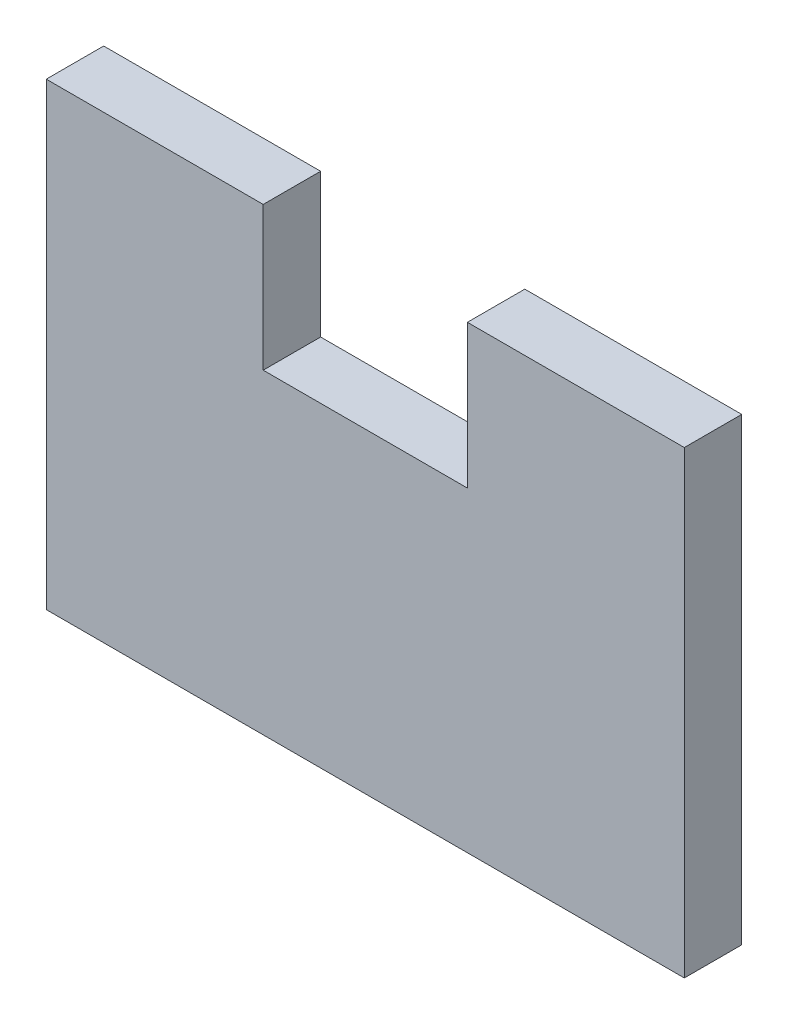
ISO-10303-21;
HEADER;
FILE_DESCRIPTION(('STEP AP214'),'2;1');
FILE_NAME('part.step','',(''),(''),'','','');
FILE_SCHEMA(('AUTOMOTIVE_DESIGN { 1 0 10303 214 1 1 1 1 }'));
ENDSEC;
DATA;
#1=APPLICATION_CONTEXT('core data for automotive mechanical design processes');
#2=APPLICATION_PROTOCOL_DEFINITION('international standard','automotive_design',2000,#1);
#3=PRODUCT_CONTEXT('',#1,'mechanical');
#4=PRODUCT('Part','Part','',(#3));
#5=PRODUCT_RELATED_PRODUCT_CATEGORY('part','',(#4));
#6=PRODUCT_DEFINITION_FORMATION('','',#4);
#7=PRODUCT_DEFINITION_CONTEXT('part definition',#1,'design');
#8=PRODUCT_DEFINITION('design','',#6,#7);
#9=PRODUCT_DEFINITION_SHAPE('','',#8);
#10=(LENGTH_UNIT() NAMED_UNIT(*) SI_UNIT(.MILLI.,.METRE.));
#11=(NAMED_UNIT(*) PLANE_ANGLE_UNIT() SI_UNIT($,.RADIAN.));
#12=(NAMED_UNIT(*) SI_UNIT($,.STERADIAN.) SOLID_ANGLE_UNIT());
#13=UNCERTAINTY_MEASURE_WITH_UNIT(LENGTH_MEASURE(1.E-05),#10,'distance_accuracy_value','');
#14=(GEOMETRIC_REPRESENTATION_CONTEXT(3) GLOBAL_UNCERTAINTY_ASSIGNED_CONTEXT((#13)) GLOBAL_UNIT_ASSIGNED_CONTEXT((#10,
#11,#12)) REPRESENTATION_CONTEXT('',''));
#15=CARTESIAN_POINT('',(0.,0.,0.));
#16=DIRECTION('',(0.,0.,1.));
#17=DIRECTION('',(1.,0.,0.));
#18=AXIS2_PLACEMENT_3D('',#15,#16,#17);
#19=CARTESIAN_POINT('',(-100.,72.,18.));
#20=DIRECTION('',(0.,-1.,0.));
#21=DIRECTION('',(0.,0.,-1.));
#22=AXIS2_PLACEMENT_3D('',#19,#20,#21);
#23=PLANE('',#22);
#24=DIRECTION('',(-1.,0.,0.));
#25=VECTOR('',#24,1.);
#26=CARTESIAN_POINT('',(-100.,72.,18.));
#27=LINE('',#26,#25);
#28=CARTESIAN_POINT('',(-32.,72.,18.));
#29=VERTEX_POINT('',#28);
#30=CARTESIAN_POINT('',(-100.,72.,18.));
#31=VERTEX_POINT('',#30);
#32=EDGE_CURVE('E145',#29,#31,#27,.T.);
#33=ORIENTED_EDGE('',*,*,#32,.F.);
#34=DIRECTION('',(0.,0.,1.));
#35=VECTOR('',#34,1.);
#36=CARTESIAN_POINT('',(-32.,72.,0.));
#37=LINE('',#36,#35);
#38=CARTESIAN_POINT('',(-32.,72.,0.));
#39=VERTEX_POINT('',#38);
#40=EDGE_CURVE('E137',#39,#29,#37,.T.);
#41=ORIENTED_EDGE('',*,*,#40,.F.);
#42=DIRECTION('',(-1.,0.,0.));
#43=VECTOR('',#42,1.);
#44=CARTESIAN_POINT('',(-100.,72.,0.));
#45=LINE('',#44,#43);
#46=CARTESIAN_POINT('',(-100.,72.,0.));
#47=VERTEX_POINT('',#46);
#48=EDGE_CURVE('E128',#39,#47,#45,.T.);
#49=ORIENTED_EDGE('',*,*,#48,.T.);
#50=DIRECTION('',(0.,0.,-1.));
#51=VECTOR('',#50,1.);
#52=CARTESIAN_POINT('',(-100.,72.,18.));
#53=LINE('',#52,#51);
#54=EDGE_CURVE('E41',#31,#47,#53,.T.);
#55=ORIENTED_EDGE('',*,*,#54,.F.);
#56=EDGE_LOOP('',(#33,#41,#49,#55));
#57=FACE_BOUND('',#56,.T.);
#58=ADVANCED_FACE('F33',(#57),#23,.F.);
#59=CARTESIAN_POINT('',(100.,72.,18.));
#60=DIRECTION('',(-1.,0.,0.));
#61=DIRECTION('',(0.,-1.,0.));
#62=AXIS2_PLACEMENT_3D('',#59,#60,#61);
#63=PLANE('',#62);
#64=DIRECTION('',(0.,1.,0.));
#65=VECTOR('',#64,1.);
#66=CARTESIAN_POINT('',(100.,72.,0.));
#67=LINE('',#66,#65);
#68=CARTESIAN_POINT('',(100.,-72.,0.));
#69=VERTEX_POINT('',#68);
#70=CARTESIAN_POINT('',(100.,72.,0.));
#71=VERTEX_POINT('',#70);
#72=EDGE_CURVE('E139',#69,#71,#67,.T.);
#73=ORIENTED_EDGE('',*,*,#72,.T.);
#74=DIRECTION('',(0.,0.,-1.));
#75=VECTOR('',#74,1.);
#76=CARTESIAN_POINT('',(100.,72.,18.));
#77=LINE('',#76,#75);
#78=CARTESIAN_POINT('',(100.,72.,18.));
#79=VERTEX_POINT('',#78);
#80=EDGE_CURVE('E11',#79,#71,#77,.T.);
#81=ORIENTED_EDGE('',*,*,#80,.F.);
#82=DIRECTION('',(0.,1.,0.));
#83=VECTOR('',#82,1.);
#84=CARTESIAN_POINT('',(100.,72.,18.));
#85=LINE('',#84,#83);
#86=CARTESIAN_POINT('',(100.,-72.,18.));
#87=VERTEX_POINT('',#86);
#88=EDGE_CURVE('E143',#87,#79,#85,.T.);
#89=ORIENTED_EDGE('',*,*,#88,.F.);
#90=DIRECTION('',(0.,0.,-1.));
#91=VECTOR('',#90,1.);
#92=CARTESIAN_POINT('',(100.,-72.,18.));
#93=LINE('',#92,#91);
#94=EDGE_CURVE('E150',#87,#69,#93,.T.);
#95=ORIENTED_EDGE('',*,*,#94,.T.);
#96=EDGE_LOOP('',(#73,#81,#89,#95));
#97=FACE_BOUND('',#96,.T.);
#98=ADVANCED_FACE('F35',(#97),#63,.F.);
#99=CARTESIAN_POINT('',(32.,72.,0.));
#100=VERTEX_POINT('',#99);
#101=EDGE_CURVE('E153',#71,#100,#45,.T.);
#102=ORIENTED_EDGE('',*,*,#101,.T.);
#103=DIRECTION('',(0.,0.,1.));
#104=VECTOR('',#103,1.);
#105=CARTESIAN_POINT('',(32.,72.,0.));
#106=LINE('',#105,#104);
#107=CARTESIAN_POINT('',(32.,72.,18.));
#108=VERTEX_POINT('',#107);
#109=EDGE_CURVE('E140',#100,#108,#106,.T.);
#110=ORIENTED_EDGE('',*,*,#109,.T.);
#111=EDGE_CURVE('E85',#79,#108,#27,.T.);
#112=ORIENTED_EDGE('',*,*,#111,.F.);
#113=ORIENTED_EDGE('',*,*,#80,.T.);
#114=EDGE_LOOP('',(#102,#110,#112,#113));
#115=FACE_BOUND('',#114,.T.);
#116=ADVANCED_FACE('F182',(#115),#23,.F.);
#117=CARTESIAN_POINT('',(-100.,72.,18.));
#118=DIRECTION('',(1.,0.,0.));
#119=DIRECTION('',(0.,1.,0.));
#120=AXIS2_PLACEMENT_3D('',#117,#118,#119);
#121=PLANE('',#120);
#122=DIRECTION('',(0.,-1.,0.));
#123=VECTOR('',#122,1.);
#124=CARTESIAN_POINT('',(-100.,72.,0.));
#125=LINE('',#124,#123);
#126=CARTESIAN_POINT('',(-100.,-72.,0.));
#127=VERTEX_POINT('',#126);
#128=EDGE_CURVE('E156',#47,#127,#125,.T.);
#129=ORIENTED_EDGE('',*,*,#128,.T.);
#130=DIRECTION('',(0.,0.,-1.));
#131=VECTOR('',#130,1.);
#132=CARTESIAN_POINT('',(-100.,-72.,18.));
#133=LINE('',#132,#131);
#134=CARTESIAN_POINT('',(-100.,-72.,18.));
#135=VERTEX_POINT('',#134);
#136=EDGE_CURVE('E160',#135,#127,#133,.T.);
#137=ORIENTED_EDGE('',*,*,#136,.F.);
#138=DIRECTION('',(0.,-1.,0.));
#139=VECTOR('',#138,1.);
#140=CARTESIAN_POINT('',(-100.,72.,18.));
#141=LINE('',#140,#139);
#142=EDGE_CURVE('E147',#31,#135,#141,.T.);
#143=ORIENTED_EDGE('',*,*,#142,.F.);
#144=ORIENTED_EDGE('',*,*,#54,.T.);
#145=EDGE_LOOP('',(#129,#137,#143,#144));
#146=FACE_BOUND('',#145,.T.);
#147=ADVANCED_FACE('F165',(#146),#121,.F.);
#148=CARTESIAN_POINT('',(-100.,-72.,18.));
#149=DIRECTION('',(0.,1.,0.));
#150=DIRECTION('',(0.,0.,1.));
#151=AXIS2_PLACEMENT_3D('',#148,#149,#150);
#152=PLANE('',#151);
#153=DIRECTION('',(1.,0.,0.));
#154=VECTOR('',#153,1.);
#155=CARTESIAN_POINT('',(-100.,-72.,0.));
#156=LINE('',#155,#154);
#157=EDGE_CURVE('E78',#127,#69,#156,.T.);
#158=ORIENTED_EDGE('',*,*,#157,.T.);
#159=ORIENTED_EDGE('',*,*,#94,.F.);
#160=DIRECTION('',(1.,0.,0.));
#161=VECTOR('',#160,1.);
#162=CARTESIAN_POINT('',(-100.,-72.,18.));
#163=LINE('',#162,#161);
#164=EDGE_CURVE('E57',#135,#87,#163,.T.);
#165=ORIENTED_EDGE('',*,*,#164,.F.);
#166=ORIENTED_EDGE('',*,*,#136,.T.);
#167=EDGE_LOOP('',(#158,#159,#165,#166));
#168=FACE_BOUND('',#167,.T.);
#169=ADVANCED_FACE('F173',(#168),#152,.F.);
#170=CARTESIAN_POINT('',(0.,0.,18.));
#171=DIRECTION('',(0.,0.,1.));
#172=DIRECTION('',(1.,0.,0.));
#173=AXIS2_PLACEMENT_3D('',#170,#171,#172);
#174=PLANE('',#173);
#175=DIRECTION('',(0.,-1.,0.));
#176=VECTOR('',#175,1.);
#177=CARTESIAN_POINT('',(-32.,72.,18.));
#178=LINE('',#177,#176);
#179=CARTESIAN_POINT('',(-32.,27.,18.));
#180=VERTEX_POINT('',#179);
#181=EDGE_CURVE('E114',#29,#180,#178,.T.);
#182=ORIENTED_EDGE('',*,*,#181,.F.);
#183=ORIENTED_EDGE('',*,*,#32,.T.);
#184=ORIENTED_EDGE('',*,*,#142,.T.);
#185=ORIENTED_EDGE('',*,*,#164,.T.);
#186=ORIENTED_EDGE('',*,*,#88,.T.);
#187=ORIENTED_EDGE('',*,*,#111,.T.);
#188=DIRECTION('',(0.,1.,0.));
#189=VECTOR('',#188,1.);
#190=CARTESIAN_POINT('',(32.,72.,18.));
#191=LINE('',#190,#189);
#192=CARTESIAN_POINT('',(32.,27.,18.));
#193=VERTEX_POINT('',#192);
#194=EDGE_CURVE('E129',#193,#108,#191,.T.);
#195=ORIENTED_EDGE('',*,*,#194,.F.);
#196=DIRECTION('',(1.,0.,0.));
#197=VECTOR('',#196,1.);
#198=CARTESIAN_POINT('',(-32.,27.,18.));
#199=LINE('',#198,#197);
#200=EDGE_CURVE('E131',#180,#193,#199,.T.);
#201=ORIENTED_EDGE('',*,*,#200,.F.);
#202=EDGE_LOOP('',(#182,#183,#184,#185,#186,#187,#195,#201));
#203=FACE_BOUND('',#202,.T.);
#204=ADVANCED_FACE('F175',(#203),#174,.T.);
#205=CARTESIAN_POINT('',(0.,0.,0.));
#206=DIRECTION('',(0.,0.,1.));
#207=DIRECTION('',(1.,0.,0.));
#208=AXIS2_PLACEMENT_3D('',#205,#206,#207);
#209=PLANE('',#208);
#210=ORIENTED_EDGE('',*,*,#48,.F.);
#211=DIRECTION('',(0.,-1.,0.));
#212=VECTOR('',#211,1.);
#213=CARTESIAN_POINT('',(-32.,72.,0.));
#214=LINE('',#213,#212);
#215=CARTESIAN_POINT('',(-32.,27.,0.));
#216=VERTEX_POINT('',#215);
#217=EDGE_CURVE('E111',#39,#216,#214,.T.);
#218=ORIENTED_EDGE('',*,*,#217,.T.);
#219=DIRECTION('',(1.,0.,0.));
#220=VECTOR('',#219,1.);
#221=CARTESIAN_POINT('',(-32.,27.,0.));
#222=LINE('',#221,#220);
#223=CARTESIAN_POINT('',(32.,27.,0.));
#224=VERTEX_POINT('',#223);
#225=EDGE_CURVE('E121',#216,#224,#222,.T.);
#226=ORIENTED_EDGE('',*,*,#225,.T.);
#227=DIRECTION('',(0.,1.,0.));
#228=VECTOR('',#227,1.);
#229=CARTESIAN_POINT('',(32.,72.,0.));
#230=LINE('',#229,#228);
#231=EDGE_CURVE('E48',#224,#100,#230,.T.);
#232=ORIENTED_EDGE('',*,*,#231,.T.);
#233=ORIENTED_EDGE('',*,*,#101,.F.);
#234=ORIENTED_EDGE('',*,*,#72,.F.);
#235=ORIENTED_EDGE('',*,*,#157,.F.);
#236=ORIENTED_EDGE('',*,*,#128,.F.);
#237=EDGE_LOOP('',(#210,#218,#226,#232,#233,#234,#235,#236));
#238=FACE_BOUND('',#237,.T.);
#239=ADVANCED_FACE('F126',(#238),#209,.F.);
#240=CARTESIAN_POINT('',(-32.,72.,0.));
#241=DIRECTION('',(-1.,0.,0.));
#242=DIRECTION('',(0.,0.,1.));
#243=AXIS2_PLACEMENT_3D('',#240,#241,#242);
#244=PLANE('',#243);
#245=ORIENTED_EDGE('',*,*,#181,.T.);
#246=DIRECTION('',(0.,0.,1.));
#247=VECTOR('',#246,1.);
#248=CARTESIAN_POINT('',(-32.,27.,0.));
#249=LINE('',#248,#247);
#250=EDGE_CURVE('E107',#216,#180,#249,.T.);
#251=ORIENTED_EDGE('',*,*,#250,.F.);
#252=ORIENTED_EDGE('',*,*,#217,.F.);
#253=ORIENTED_EDGE('',*,*,#40,.T.);
#254=EDGE_LOOP('',(#245,#251,#252,#253));
#255=FACE_BOUND('',#254,.T.);
#256=ADVANCED_FACE('F109',(#255),#244,.F.);
#257=CARTESIAN_POINT('',(32.,72.,0.));
#258=DIRECTION('',(1.,0.,0.));
#259=DIRECTION('',(0.,0.,-1.));
#260=AXIS2_PLACEMENT_3D('',#257,#258,#259);
#261=PLANE('',#260);
#262=ORIENTED_EDGE('',*,*,#194,.T.);
#263=ORIENTED_EDGE('',*,*,#109,.F.);
#264=ORIENTED_EDGE('',*,*,#231,.F.);
#265=DIRECTION('',(0.,0.,1.));
#266=VECTOR('',#265,1.);
#267=CARTESIAN_POINT('',(32.,27.,0.));
#268=LINE('',#267,#266);
#269=EDGE_CURVE('E118',#224,#193,#268,.T.);
#270=ORIENTED_EDGE('',*,*,#269,.T.);
#271=EDGE_LOOP('',(#262,#263,#264,#270));
#272=FACE_BOUND('',#271,.T.);
#273=ADVANCED_FACE('F193',(#272),#261,.F.);
#274=CARTESIAN_POINT('',(-32.,27.,0.));
#275=DIRECTION('',(0.,-1.,0.));
#276=DIRECTION('',(1.,0.,0.));
#277=AXIS2_PLACEMENT_3D('',#274,#275,#276);
#278=PLANE('',#277);
#279=ORIENTED_EDGE('',*,*,#200,.T.);
#280=ORIENTED_EDGE('',*,*,#269,.F.);
#281=ORIENTED_EDGE('',*,*,#225,.F.);
#282=ORIENTED_EDGE('',*,*,#250,.T.);
#283=EDGE_LOOP('',(#279,#280,#281,#282));
#284=FACE_BOUND('',#283,.T.);
#285=ADVANCED_FACE('F122',(#284),#278,.F.);
#286=CLOSED_SHELL('',(#58,#98,#116,#147,#169,#204,#239,#256,#273,#285));
#287=MANIFOLD_SOLID_BREP('B2',#286);
#288=ADVANCED_BREP_SHAPE_REPRESENTATION('',(#18,#287),#14);
#289=SHAPE_DEFINITION_REPRESENTATION(#9,#288);
ENDSEC;
END-ISO-10303-21;
